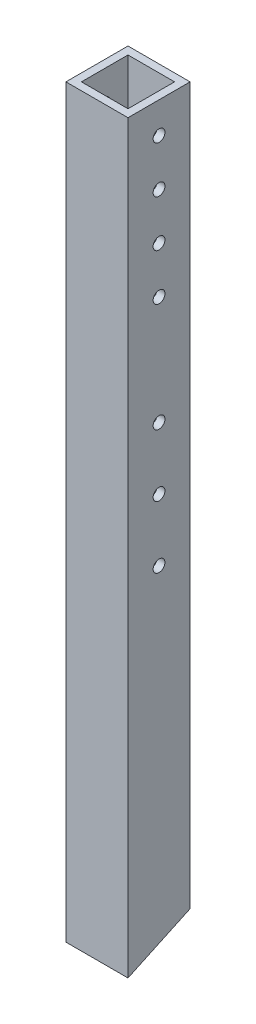
ISO-10303-21;
HEADER;
FILE_DESCRIPTION(('STEP AP214'),'2;1');
FILE_NAME('part.step','',(''),(''),'','','');
FILE_SCHEMA(('AUTOMOTIVE_DESIGN { 1 0 10303 214 1 1 1 1 }'));
ENDSEC;
DATA;
#1=APPLICATION_CONTEXT('core data for automotive mechanical design processes');
#2=APPLICATION_PROTOCOL_DEFINITION('international standard','automotive_design',2000,#1);
#3=PRODUCT_CONTEXT('',#1,'mechanical');
#4=PRODUCT('Part','Part','',(#3));
#5=PRODUCT_RELATED_PRODUCT_CATEGORY('part','',(#4));
#6=PRODUCT_DEFINITION_FORMATION('','',#4);
#7=PRODUCT_DEFINITION_CONTEXT('part definition',#1,'design');
#8=PRODUCT_DEFINITION('design','',#6,#7);
#9=PRODUCT_DEFINITION_SHAPE('','',#8);
#10=(LENGTH_UNIT() NAMED_UNIT(*) SI_UNIT(.MILLI.,.METRE.));
#11=(NAMED_UNIT(*) PLANE_ANGLE_UNIT() SI_UNIT($,.RADIAN.));
#12=(NAMED_UNIT(*) SI_UNIT($,.STERADIAN.) SOLID_ANGLE_UNIT());
#13=UNCERTAINTY_MEASURE_WITH_UNIT(LENGTH_MEASURE(1.E-05),#10,'distance_accuracy_value','');
#14=(GEOMETRIC_REPRESENTATION_CONTEXT(3) GLOBAL_UNCERTAINTY_ASSIGNED_CONTEXT((#13)) GLOBAL_UNIT_ASSIGNED_CONTEXT((#10,
#11,#12)) REPRESENTATION_CONTEXT('',''));
#15=CARTESIAN_POINT('',(0.,0.,0.));
#16=DIRECTION('',(0.,0.,1.));
#17=DIRECTION('',(1.,0.,0.));
#18=AXIS2_PLACEMENT_3D('',#15,#16,#17);
#19=CARTESIAN_POINT('',(12.7,304.8,-12.7));
#20=DIRECTION('',(0.,-1.,0.));
#21=DIRECTION('',(0.,0.,-1.));
#22=AXIS2_PLACEMENT_3D('',#19,#20,#21);
#23=PLANE('',#22);
#24=DIRECTION('',(0.,0.,-1.));
#25=VECTOR('',#24,1.);
#26=CARTESIAN_POINT('',(12.7,304.8,12.7));
#27=LINE('',#26,#25);
#28=CARTESIAN_POINT('',(12.7,304.8,12.7));
#29=VERTEX_POINT('',#28);
#30=CARTESIAN_POINT('',(12.7,304.8,-12.7));
#31=VERTEX_POINT('',#30);
#32=EDGE_CURVE('E228',#29,#31,#27,.T.);
#33=ORIENTED_EDGE('',*,*,#32,.T.);
#34=DIRECTION('',(-1.,0.,0.));
#35=VECTOR('',#34,1.);
#36=CARTESIAN_POINT('',(-12.7,304.8,-12.7));
#37=LINE('',#36,#35);
#38=CARTESIAN_POINT('',(-12.7,304.8,-12.7));
#39=VERTEX_POINT('',#38);
#40=EDGE_CURVE('E231',#31,#39,#37,.T.);
#41=ORIENTED_EDGE('',*,*,#40,.T.);
#42=DIRECTION('',(0.,0.,1.));
#43=VECTOR('',#42,1.);
#44=CARTESIAN_POINT('',(-12.7,304.8,12.7));
#45=LINE('',#44,#43);
#46=CARTESIAN_POINT('',(-12.7,304.8,12.7));
#47=VERTEX_POINT('',#46);
#48=EDGE_CURVE('E118',#39,#47,#45,.T.);
#49=ORIENTED_EDGE('',*,*,#48,.T.);
#50=DIRECTION('',(1.,0.,0.));
#51=VECTOR('',#50,1.);
#52=CARTESIAN_POINT('',(-12.7,304.8,12.7));
#53=LINE('',#52,#51);
#54=EDGE_CURVE('E234',#47,#29,#53,.T.);
#55=ORIENTED_EDGE('',*,*,#54,.T.);
#56=EDGE_LOOP('',(#33,#41,#49,#55));
#57=FACE_BOUND('',#56,.T.);
#58=DIRECTION('',(1.,0.,0.));
#59=VECTOR('',#58,1.);
#60=CARTESIAN_POINT('',(-9.525,304.8,9.525));
#61=LINE('',#60,#59);
#62=CARTESIAN_POINT('',(-9.525,304.8,9.525));
#63=VERTEX_POINT('',#62);
#64=CARTESIAN_POINT('',(9.525,304.8,9.525));
#65=VERTEX_POINT('',#64);
#66=EDGE_CURVE('E210',#63,#65,#61,.T.);
#67=ORIENTED_EDGE('',*,*,#66,.F.);
#68=DIRECTION('',(0.,0.,1.));
#69=VECTOR('',#68,1.);
#70=CARTESIAN_POINT('',(-9.525,304.8,9.525));
#71=LINE('',#70,#69);
#72=CARTESIAN_POINT('',(-9.525,304.8,-9.525));
#73=VERTEX_POINT('',#72);
#74=EDGE_CURVE('E216',#73,#63,#71,.T.);
#75=ORIENTED_EDGE('',*,*,#74,.F.);
#76=DIRECTION('',(-1.,0.,0.));
#77=VECTOR('',#76,1.);
#78=CARTESIAN_POINT('',(-9.525,304.8,-9.525));
#79=LINE('',#78,#77);
#80=CARTESIAN_POINT('',(9.525,304.8,-9.525));
#81=VERTEX_POINT('',#80);
#82=EDGE_CURVE('E214',#81,#73,#79,.T.);
#83=ORIENTED_EDGE('',*,*,#82,.F.);
#84=DIRECTION('',(0.,0.,-1.));
#85=VECTOR('',#84,1.);
#86=CARTESIAN_POINT('',(9.525,304.8,9.525));
#87=LINE('',#86,#85);
#88=EDGE_CURVE('E212',#65,#81,#87,.T.);
#89=ORIENTED_EDGE('',*,*,#88,.F.);
#90=EDGE_LOOP('',(#67,#75,#83,#89));
#91=FACE_BOUND('',#90,.T.);
#92=ADVANCED_FACE('F31',(#57,#91),#23,.F.);
#93=CARTESIAN_POINT('',(12.7,304.8,12.7));
#94=DIRECTION('',(-1.,0.,0.));
#95=DIRECTION('',(0.,0.,1.));
#96=AXIS2_PLACEMENT_3D('',#93,#94,#95);
#97=PLANE('',#96);
#98=CARTESIAN_POINT('',(12.7,139.7,0.));
#99=DIRECTION('',(1.,0.,0.));
#100=DIRECTION('',(0.,0.,-1.));
#101=AXIS2_PLACEMENT_3D('',#98,#99,#100);
#102=CIRCLE('',#101,2.41300000000002);
#103=CARTESIAN_POINT('',(12.7,139.7,-2.41300000000002));
#104=VERTEX_POINT('',#103);
#105=EDGE_CURVE('E293',#104,#104,#102,.T.);
#106=ORIENTED_EDGE('',*,*,#105,.F.);
#107=EDGE_LOOP('',(#106));
#108=FACE_BOUND('',#107,.T.);
#109=CARTESIAN_POINT('',(12.7,165.1,0.));
#110=DIRECTION('',(1.,0.,0.));
#111=DIRECTION('',(0.,0.,-1.));
#112=AXIS2_PLACEMENT_3D('',#109,#110,#111);
#113=CIRCLE('',#112,2.41300000000002);
#114=CARTESIAN_POINT('',(12.7,165.1,-2.41299999999999));
#115=VERTEX_POINT('',#114);
#116=EDGE_CURVE('E160',#115,#115,#113,.T.);
#117=ORIENTED_EDGE('',*,*,#116,.F.);
#118=EDGE_LOOP('',(#117));
#119=FACE_BOUND('',#118,.T.);
#120=CARTESIAN_POINT('',(12.7,190.5,0.));
#121=DIRECTION('',(1.,0.,0.));
#122=DIRECTION('',(0.,0.,-1.));
#123=AXIS2_PLACEMENT_3D('',#120,#121,#122);
#124=CIRCLE('',#123,2.41300000000001);
#125=CARTESIAN_POINT('',(12.7,190.5,-2.41300000000002));
#126=VERTEX_POINT('',#125);
#127=EDGE_CURVE('E157',#126,#126,#124,.T.);
#128=ORIENTED_EDGE('',*,*,#127,.F.);
#129=EDGE_LOOP('',(#128));
#130=FACE_BOUND('',#129,.T.);
#131=CARTESIAN_POINT('',(12.7,234.95,0.));
#132=DIRECTION('',(1.,0.,0.));
#133=DIRECTION('',(0.,0.,-1.));
#134=AXIS2_PLACEMENT_3D('',#131,#132,#133);
#135=CIRCLE('',#134,2.41300000000001);
#136=CARTESIAN_POINT('',(12.7,234.95,-2.41300000000001));
#137=VERTEX_POINT('',#136);
#138=EDGE_CURVE('E176',#137,#137,#135,.T.);
#139=ORIENTED_EDGE('',*,*,#138,.F.);
#140=EDGE_LOOP('',(#139));
#141=FACE_BOUND('',#140,.T.);
#142=CARTESIAN_POINT('',(12.7,254.,0.));
#143=DIRECTION('',(1.,0.,0.));
#144=DIRECTION('',(0.,0.,-1.));
#145=AXIS2_PLACEMENT_3D('',#142,#143,#144);
#146=CIRCLE('',#145,2.41300000000001);
#147=CARTESIAN_POINT('',(12.7,254.,-2.41300000000001));
#148=VERTEX_POINT('',#147);
#149=EDGE_CURVE('E183',#148,#148,#146,.T.);
#150=ORIENTED_EDGE('',*,*,#149,.F.);
#151=EDGE_LOOP('',(#150));
#152=FACE_BOUND('',#151,.T.);
#153=CARTESIAN_POINT('',(12.7,273.05,0.));
#154=DIRECTION('',(1.,0.,0.));
#155=DIRECTION('',(0.,0.,-1.));
#156=AXIS2_PLACEMENT_3D('',#153,#154,#155);
#157=CIRCLE('',#156,2.41300000000001);
#158=CARTESIAN_POINT('',(12.7,273.05,-2.41300000000001));
#159=VERTEX_POINT('',#158);
#160=EDGE_CURVE('E190',#159,#159,#157,.T.);
#161=ORIENTED_EDGE('',*,*,#160,.F.);
#162=EDGE_LOOP('',(#161));
#163=FACE_BOUND('',#162,.T.);
#164=CARTESIAN_POINT('',(12.7,292.1,0.));
#165=DIRECTION('',(1.,0.,0.));
#166=DIRECTION('',(0.,0.,-1.));
#167=AXIS2_PLACEMENT_3D('',#164,#165,#166);
#168=CIRCLE('',#167,2.41300000000001);
#169=CARTESIAN_POINT('',(12.7,292.1,-2.41300000000001));
#170=VERTEX_POINT('',#169);
#171=EDGE_CURVE('E203',#170,#170,#168,.T.);
#172=ORIENTED_EDGE('',*,*,#171,.F.);
#173=EDGE_LOOP('',(#172));
#174=FACE_BOUND('',#173,.T.);
#175=DIRECTION('',(0.,-1.,0.));
#176=VECTOR('',#175,1.);
#177=CARTESIAN_POINT('',(12.7,304.8,12.7));
#178=LINE('',#177,#176);
#179=CARTESIAN_POINT('',(12.7,0.,12.7));
#180=VERTEX_POINT('',#179);
#181=EDGE_CURVE('E122',#29,#180,#178,.T.);
#182=ORIENTED_EDGE('',*,*,#181,.T.);
#183=DIRECTION('',(0.,-0.422618261740695,0.906307787036652));
#184=VECTOR('',#183,1.);
#185=CARTESIAN_POINT('',(12.7,0.,12.7));
#186=LINE('',#185,#184);
#187=CARTESIAN_POINT('',(12.7,11.8442145171368,-12.7));
#188=VERTEX_POINT('',#187);
#189=EDGE_CURVE('E107',#188,#180,#186,.T.);
#190=ORIENTED_EDGE('',*,*,#189,.F.);
#191=DIRECTION('',(0.,-1.,0.));
#192=VECTOR('',#191,1.);
#193=CARTESIAN_POINT('',(12.7,304.8,-12.7));
#194=LINE('',#193,#192);
#195=EDGE_CURVE('E40',#31,#188,#194,.T.);
#196=ORIENTED_EDGE('',*,*,#195,.F.);
#197=ORIENTED_EDGE('',*,*,#32,.F.);
#198=EDGE_LOOP('',(#182,#190,#196,#197));
#199=FACE_BOUND('',#198,.T.);
#200=ADVANCED_FACE('F33',(#108,#119,#130,#141,#152,#163,#174,#199),#97,.F.);
#201=CARTESIAN_POINT('',(-12.7,304.8,-12.7));
#202=DIRECTION('',(0.,0.,1.));
#203=DIRECTION('',(1.,0.,0.));
#204=AXIS2_PLACEMENT_3D('',#201,#202,#203);
#205=PLANE('',#204);
#206=ORIENTED_EDGE('',*,*,#195,.T.);
#207=DIRECTION('',(1.,0.,0.));
#208=VECTOR('',#207,1.);
#209=CARTESIAN_POINT('',(-12.7,11.8442145171368,-12.7));
#210=LINE('',#209,#208);
#211=CARTESIAN_POINT('',(-12.7,11.8442145171368,-12.7));
#212=VERTEX_POINT('',#211);
#213=EDGE_CURVE('E99',#212,#188,#210,.T.);
#214=ORIENTED_EDGE('',*,*,#213,.F.);
#215=DIRECTION('',(0.,-1.,0.));
#216=VECTOR('',#215,1.);
#217=CARTESIAN_POINT('',(-12.7,304.8,-12.7));
#218=LINE('',#217,#216);
#219=EDGE_CURVE('E113',#39,#212,#218,.T.);
#220=ORIENTED_EDGE('',*,*,#219,.F.);
#221=ORIENTED_EDGE('',*,*,#40,.F.);
#222=EDGE_LOOP('',(#206,#214,#220,#221));
#223=FACE_BOUND('',#222,.T.);
#224=ADVANCED_FACE('F112',(#223),#205,.F.);
#225=CARTESIAN_POINT('',(-12.7,304.8,12.7));
#226=DIRECTION('',(1.,0.,0.));
#227=DIRECTION('',(0.,0.,-1.));
#228=AXIS2_PLACEMENT_3D('',#225,#226,#227);
#229=PLANE('',#228);
#230=CARTESIAN_POINT('',(-12.7,139.7,0.));
#231=DIRECTION('',(1.,0.,0.));
#232=DIRECTION('',(0.,0.,-1.));
#233=AXIS2_PLACEMENT_3D('',#230,#231,#232);
#234=CIRCLE('',#233,2.41300000000002);
#235=CARTESIAN_POINT('',(-12.7,139.7,-2.41300000000002));
#236=VERTEX_POINT('',#235);
#237=EDGE_CURVE('E355',#236,#236,#234,.T.);
#238=ORIENTED_EDGE('',*,*,#237,.T.);
#239=EDGE_LOOP('',(#238));
#240=FACE_BOUND('',#239,.T.);
#241=CARTESIAN_POINT('',(-12.7,165.1,0.));
#242=DIRECTION('',(1.,0.,0.));
#243=DIRECTION('',(0.,0.,-1.));
#244=AXIS2_PLACEMENT_3D('',#241,#242,#243);
#245=CIRCLE('',#244,2.41300000000002);
#246=CARTESIAN_POINT('',(-12.7,165.1,-2.41299999999999));
#247=VERTEX_POINT('',#246);
#248=EDGE_CURVE('E153',#247,#247,#245,.T.);
#249=ORIENTED_EDGE('',*,*,#248,.T.);
#250=EDGE_LOOP('',(#249));
#251=FACE_BOUND('',#250,.T.);
#252=CARTESIAN_POINT('',(-12.7,190.5,0.));
#253=DIRECTION('',(1.,0.,0.));
#254=DIRECTION('',(0.,0.,-1.));
#255=AXIS2_PLACEMENT_3D('',#252,#253,#254);
#256=CIRCLE('',#255,2.41300000000001);
#257=CARTESIAN_POINT('',(-12.7,190.5,-2.41300000000002));
#258=VERTEX_POINT('',#257);
#259=EDGE_CURVE('E149',#258,#258,#256,.T.);
#260=ORIENTED_EDGE('',*,*,#259,.T.);
#261=EDGE_LOOP('',(#260));
#262=FACE_BOUND('',#261,.T.);
#263=CARTESIAN_POINT('',(-12.7,234.95,0.));
#264=DIRECTION('',(1.,0.,0.));
#265=DIRECTION('',(0.,0.,-1.));
#266=AXIS2_PLACEMENT_3D('',#263,#264,#265);
#267=CIRCLE('',#266,2.41300000000001);
#268=CARTESIAN_POINT('',(-12.7,234.95,-2.41300000000001));
#269=VERTEX_POINT('',#268);
#270=EDGE_CURVE('E145',#269,#269,#267,.T.);
#271=ORIENTED_EDGE('',*,*,#270,.T.);
#272=EDGE_LOOP('',(#271));
#273=FACE_BOUND('',#272,.T.);
#274=CARTESIAN_POINT('',(-12.7,254.,0.));
#275=DIRECTION('',(1.,0.,0.));
#276=DIRECTION('',(0.,0.,-1.));
#277=AXIS2_PLACEMENT_3D('',#274,#275,#276);
#278=CIRCLE('',#277,2.41300000000001);
#279=CARTESIAN_POINT('',(-12.7,254.,-2.41300000000001));
#280=VERTEX_POINT('',#279);
#281=EDGE_CURVE('E140',#280,#280,#278,.T.);
#282=ORIENTED_EDGE('',*,*,#281,.T.);
#283=EDGE_LOOP('',(#282));
#284=FACE_BOUND('',#283,.T.);
#285=CARTESIAN_POINT('',(-12.7,273.05,0.));
#286=DIRECTION('',(1.,0.,0.));
#287=DIRECTION('',(0.,0.,-1.));
#288=AXIS2_PLACEMENT_3D('',#285,#286,#287);
#289=CIRCLE('',#288,2.41300000000001);
#290=CARTESIAN_POINT('',(-12.7,273.05,-2.41300000000001));
#291=VERTEX_POINT('',#290);
#292=EDGE_CURVE('E135',#291,#291,#289,.T.);
#293=ORIENTED_EDGE('',*,*,#292,.T.);
#294=EDGE_LOOP('',(#293));
#295=FACE_BOUND('',#294,.T.);
#296=CARTESIAN_POINT('',(-12.7,292.1,0.));
#297=DIRECTION('',(1.,0.,0.));
#298=DIRECTION('',(0.,0.,-1.));
#299=AXIS2_PLACEMENT_3D('',#296,#297,#298);
#300=CIRCLE('',#299,2.41300000000001);
#301=CARTESIAN_POINT('',(-12.7,292.1,-2.41300000000001));
#302=VERTEX_POINT('',#301);
#303=EDGE_CURVE('E129',#302,#302,#300,.T.);
#304=ORIENTED_EDGE('',*,*,#303,.T.);
#305=EDGE_LOOP('',(#304));
#306=FACE_BOUND('',#305,.T.);
#307=ORIENTED_EDGE('',*,*,#219,.T.);
#308=DIRECTION('',(0.,-0.422618261740695,0.906307787036652));
#309=VECTOR('',#308,1.);
#310=CARTESIAN_POINT('',(-12.7,0.,12.7));
#311=LINE('',#310,#309);
#312=CARTESIAN_POINT('',(-12.7,0.,12.7));
#313=VERTEX_POINT('',#312);
#314=EDGE_CURVE('E96',#212,#313,#311,.T.);
#315=ORIENTED_EDGE('',*,*,#314,.T.);
#316=DIRECTION('',(0.,-1.,0.));
#317=VECTOR('',#316,1.);
#318=CARTESIAN_POINT('',(-12.7,304.8,12.7));
#319=LINE('',#318,#317);
#320=EDGE_CURVE('E119',#47,#313,#319,.T.);
#321=ORIENTED_EDGE('',*,*,#320,.F.);
#322=ORIENTED_EDGE('',*,*,#48,.F.);
#323=EDGE_LOOP('',(#307,#315,#321,#322));
#324=FACE_BOUND('',#323,.T.);
#325=ADVANCED_FACE('F117',(#240,#251,#262,#273,#284,#295,#306,#324),#229,.F.);
#326=CARTESIAN_POINT('',(-12.7,304.8,12.7));
#327=DIRECTION('',(0.,0.,-1.));
#328=DIRECTION('',(-1.,0.,0.));
#329=AXIS2_PLACEMENT_3D('',#326,#327,#328);
#330=PLANE('',#329);
#331=DIRECTION('',(1.,0.,0.));
#332=VECTOR('',#331,1.);
#333=CARTESIAN_POINT('',(-12.7,0.,12.7));
#334=LINE('',#333,#332);
#335=EDGE_CURVE('E102',#313,#180,#334,.T.);
#336=ORIENTED_EDGE('',*,*,#335,.T.);
#337=ORIENTED_EDGE('',*,*,#181,.F.);
#338=ORIENTED_EDGE('',*,*,#54,.F.);
#339=ORIENTED_EDGE('',*,*,#320,.T.);
#340=EDGE_LOOP('',(#336,#337,#338,#339));
#341=FACE_BOUND('',#340,.T.);
#342=ADVANCED_FACE('F242',(#341),#330,.F.);
#343=CARTESIAN_POINT('',(-9.525,304.8,9.525));
#344=DIRECTION('',(0.,0.,-1.));
#345=DIRECTION('',(-1.,0.,0.));
#346=AXIS2_PLACEMENT_3D('',#343,#344,#345);
#347=PLANE('',#346);
#348=DIRECTION('',(1.,0.,0.));
#349=VECTOR('',#348,1.);
#350=CARTESIAN_POINT('',(-9.525,1.48052681464211,9.525));
#351=LINE('',#350,#349);
#352=CARTESIAN_POINT('',(-9.525,1.48052681464209,9.52500000000001));
#353=VERTEX_POINT('',#352);
#354=CARTESIAN_POINT('',(9.525,1.48052681464209,9.52500000000001));
#355=VERTEX_POINT('',#354);
#356=EDGE_CURVE('E201',#353,#355,#351,.T.);
#357=ORIENTED_EDGE('',*,*,#356,.F.);
#358=DIRECTION('',(0.,-1.,0.));
#359=VECTOR('',#358,1.);
#360=CARTESIAN_POINT('',(-9.525,304.8,9.525));
#361=LINE('',#360,#359);
#362=EDGE_CURVE('E218',#63,#353,#361,.T.);
#363=ORIENTED_EDGE('',*,*,#362,.F.);
#364=ORIENTED_EDGE('',*,*,#66,.T.);
#365=DIRECTION('',(0.,-1.,0.));
#366=VECTOR('',#365,1.);
#367=CARTESIAN_POINT('',(9.525,304.8,9.525));
#368=LINE('',#367,#366);
#369=EDGE_CURVE('E225',#65,#355,#368,.T.);
#370=ORIENTED_EDGE('',*,*,#369,.T.);
#371=EDGE_LOOP('',(#357,#363,#364,#370));
#372=FACE_BOUND('',#371,.T.);
#373=ADVANCED_FACE('F255',(#372),#347,.T.);
#374=CARTESIAN_POINT('',(9.525,304.8,9.525));
#375=DIRECTION('',(-1.,0.,0.));
#376=DIRECTION('',(0.,0.,1.));
#377=AXIS2_PLACEMENT_3D('',#374,#375,#376);
#378=PLANE('',#377);
#379=CARTESIAN_POINT('',(9.525,139.7,0.));
#380=DIRECTION('',(-1.,0.,0.));
#381=DIRECTION('',(0.,0.,1.));
#382=AXIS2_PLACEMENT_3D('',#379,#380,#381);
#383=CIRCLE('',#382,2.41300000000002);
#384=CARTESIAN_POINT('',(9.525,139.7,2.41300000000002));
#385=VERTEX_POINT('',#384);
#386=EDGE_CURVE('E165',#385,#385,#383,.T.);
#387=ORIENTED_EDGE('',*,*,#386,.F.);
#388=EDGE_LOOP('',(#387));
#389=FACE_BOUND('',#388,.T.);
#390=CARTESIAN_POINT('',(9.525,165.1,0.));
#391=DIRECTION('',(-1.,0.,0.));
#392=DIRECTION('',(0.,0.,1.));
#393=AXIS2_PLACEMENT_3D('',#390,#391,#392);
#394=CIRCLE('',#393,2.41300000000002);
#395=CARTESIAN_POINT('',(9.525,165.1,2.41300000000004));
#396=VERTEX_POINT('',#395);
#397=EDGE_CURVE('E152',#396,#396,#394,.T.);
#398=ORIENTED_EDGE('',*,*,#397,.F.);
#399=EDGE_LOOP('',(#398));
#400=FACE_BOUND('',#399,.T.);
#401=CARTESIAN_POINT('',(9.525,190.5,0.));
#402=DIRECTION('',(-1.,0.,0.));
#403=DIRECTION('',(0.,0.,1.));
#404=AXIS2_PLACEMENT_3D('',#401,#402,#403);
#405=CIRCLE('',#404,2.41300000000001);
#406=CARTESIAN_POINT('',(9.525,190.5,2.413));
#407=VERTEX_POINT('',#406);
#408=EDGE_CURVE('E148',#407,#407,#405,.T.);
#409=ORIENTED_EDGE('',*,*,#408,.F.);
#410=EDGE_LOOP('',(#409));
#411=FACE_BOUND('',#410,.T.);
#412=CARTESIAN_POINT('',(9.525,234.95,0.));
#413=DIRECTION('',(-1.,0.,0.));
#414=DIRECTION('',(0.,0.,1.));
#415=AXIS2_PLACEMENT_3D('',#412,#413,#414);
#416=CIRCLE('',#415,2.41300000000001);
#417=CARTESIAN_POINT('',(9.525,234.95,2.41300000000002));
#418=VERTEX_POINT('',#417);
#419=EDGE_CURVE('E144',#418,#418,#416,.T.);
#420=ORIENTED_EDGE('',*,*,#419,.F.);
#421=EDGE_LOOP('',(#420));
#422=FACE_BOUND('',#421,.T.);
#423=CARTESIAN_POINT('',(9.525,254.,0.));
#424=DIRECTION('',(-1.,0.,0.));
#425=DIRECTION('',(0.,0.,1.));
#426=AXIS2_PLACEMENT_3D('',#423,#424,#425);
#427=CIRCLE('',#426,2.41300000000001);
#428=CARTESIAN_POINT('',(9.525,254.,2.41300000000002));
#429=VERTEX_POINT('',#428);
#430=EDGE_CURVE('E139',#429,#429,#427,.T.);
#431=ORIENTED_EDGE('',*,*,#430,.F.);
#432=EDGE_LOOP('',(#431));
#433=FACE_BOUND('',#432,.T.);
#434=CARTESIAN_POINT('',(9.525,273.05,0.));
#435=DIRECTION('',(-1.,0.,0.));
#436=DIRECTION('',(0.,0.,1.));
#437=AXIS2_PLACEMENT_3D('',#434,#435,#436);
#438=CIRCLE('',#437,2.41300000000001);
#439=CARTESIAN_POINT('',(9.525,273.05,2.41300000000001));
#440=VERTEX_POINT('',#439);
#441=EDGE_CURVE('E134',#440,#440,#438,.T.);
#442=ORIENTED_EDGE('',*,*,#441,.F.);
#443=EDGE_LOOP('',(#442));
#444=FACE_BOUND('',#443,.T.);
#445=DIRECTION('',(0.,0.422618261740695,-0.906307787036652));
#446=VECTOR('',#445,1.);
#447=CARTESIAN_POINT('',(9.525,55.6552638372215,-106.653098461709));
#448=LINE('',#447,#446);
#449=CARTESIAN_POINT('',(9.525,10.3636877024947,-9.525));
#450=VERTEX_POINT('',#449);
#451=EDGE_CURVE('E199',#355,#450,#448,.T.);
#452=ORIENTED_EDGE('',*,*,#451,.F.);
#453=ORIENTED_EDGE('',*,*,#369,.F.);
#454=ORIENTED_EDGE('',*,*,#88,.T.);
#455=DIRECTION('',(0.,-1.,0.));
#456=VECTOR('',#455,1.);
#457=CARTESIAN_POINT('',(9.525,304.8,-9.525));
#458=LINE('',#457,#456);
#459=EDGE_CURVE('E222',#81,#450,#458,.T.);
#460=ORIENTED_EDGE('',*,*,#459,.T.);
#461=EDGE_LOOP('',(#452,#453,#454,#460));
#462=FACE_BOUND('',#461,.T.);
#463=CARTESIAN_POINT('',(9.525,292.1,0.));
#464=DIRECTION('',(-1.,0.,0.));
#465=DIRECTION('',(0.,0.,1.));
#466=AXIS2_PLACEMENT_3D('',#463,#464,#465);
#467=CIRCLE('',#466,2.41300000000001);
#468=CARTESIAN_POINT('',(9.525,292.1,2.41300000000001));
#469=VERTEX_POINT('',#468);
#470=EDGE_CURVE('E128',#469,#469,#467,.T.);
#471=ORIENTED_EDGE('',*,*,#470,.F.);
#472=EDGE_LOOP('',(#471));
#473=FACE_BOUND('',#472,.T.);
#474=ADVANCED_FACE('F258',(#389,#400,#411,#422,#433,#444,#462,#473),#378,.T.);
#475=CARTESIAN_POINT('',(-9.525,304.8,-9.525));
#476=DIRECTION('',(0.,0.,1.));
#477=DIRECTION('',(1.,0.,0.));
#478=AXIS2_PLACEMENT_3D('',#475,#476,#477);
#479=PLANE('',#478);
#480=DIRECTION('',(-1.,0.,0.));
#481=VECTOR('',#480,1.);
#482=CARTESIAN_POINT('',(-9.525,10.3636877024947,-9.525));
#483=LINE('',#482,#481);
#484=CARTESIAN_POINT('',(-9.525,10.3636877024948,-9.52500000000002));
#485=VERTEX_POINT('',#484);
#486=EDGE_CURVE('E47',#450,#485,#483,.T.);
#487=ORIENTED_EDGE('',*,*,#486,.F.);
#488=ORIENTED_EDGE('',*,*,#459,.F.);
#489=ORIENTED_EDGE('',*,*,#82,.T.);
#490=DIRECTION('',(0.,-1.,0.));
#491=VECTOR('',#490,1.);
#492=CARTESIAN_POINT('',(-9.525,304.8,-9.525));
#493=LINE('',#492,#491);
#494=EDGE_CURVE('E54',#73,#485,#493,.T.);
#495=ORIENTED_EDGE('',*,*,#494,.T.);
#496=EDGE_LOOP('',(#487,#488,#489,#495));
#497=FACE_BOUND('',#496,.T.);
#498=ADVANCED_FACE('F262',(#497),#479,.T.);
#499=CARTESIAN_POINT('',(-9.525,304.8,9.525));
#500=DIRECTION('',(1.,0.,0.));
#501=DIRECTION('',(0.,0.,-1.));
#502=AXIS2_PLACEMENT_3D('',#499,#500,#501);
#503=PLANE('',#502);
#504=CARTESIAN_POINT('',(-9.525,139.7,0.));
#505=DIRECTION('',(1.,0.,0.));
#506=DIRECTION('',(0.,0.,-1.));
#507=AXIS2_PLACEMENT_3D('',#504,#505,#506);
#508=CIRCLE('',#507,2.41300000000002);
#509=CARTESIAN_POINT('',(-9.525,139.7,-2.41300000000002));
#510=VERTEX_POINT('',#509);
#511=EDGE_CURVE('E35',#510,#510,#508,.T.);
#512=ORIENTED_EDGE('',*,*,#511,.F.);
#513=EDGE_LOOP('',(#512));
#514=FACE_BOUND('',#513,.T.);
#515=CARTESIAN_POINT('',(-9.525,165.1,0.));
#516=DIRECTION('',(1.,0.,0.));
#517=DIRECTION('',(0.,0.,-1.));
#518=AXIS2_PLACEMENT_3D('',#515,#516,#517);
#519=CIRCLE('',#518,2.41300000000002);
#520=CARTESIAN_POINT('',(-9.525,165.1,-2.41299999999999));
#521=VERTEX_POINT('',#520);
#522=EDGE_CURVE('E150',#521,#521,#519,.T.);
#523=ORIENTED_EDGE('',*,*,#522,.F.);
#524=EDGE_LOOP('',(#523));
#525=FACE_BOUND('',#524,.T.);
#526=CARTESIAN_POINT('',(-9.525,190.5,0.));
#527=DIRECTION('',(1.,0.,0.));
#528=DIRECTION('',(0.,0.,-1.));
#529=AXIS2_PLACEMENT_3D('',#526,#527,#528);
#530=CIRCLE('',#529,2.41300000000001);
#531=CARTESIAN_POINT('',(-9.525,190.5,-2.41300000000002));
#532=VERTEX_POINT('',#531);
#533=EDGE_CURVE('E146',#532,#532,#530,.T.);
#534=ORIENTED_EDGE('',*,*,#533,.F.);
#535=EDGE_LOOP('',(#534));
#536=FACE_BOUND('',#535,.T.);
#537=CARTESIAN_POINT('',(-9.525,234.95,0.));
#538=DIRECTION('',(1.,0.,0.));
#539=DIRECTION('',(0.,0.,-1.));
#540=AXIS2_PLACEMENT_3D('',#537,#538,#539);
#541=CIRCLE('',#540,2.41300000000001);
#542=CARTESIAN_POINT('',(-9.525,234.95,-2.41300000000001));
#543=VERTEX_POINT('',#542);
#544=EDGE_CURVE('E141',#543,#543,#541,.T.);
#545=ORIENTED_EDGE('',*,*,#544,.F.);
#546=EDGE_LOOP('',(#545));
#547=FACE_BOUND('',#546,.T.);
#548=CARTESIAN_POINT('',(-9.525,254.,0.));
#549=DIRECTION('',(1.,0.,0.));
#550=DIRECTION('',(0.,0.,-1.));
#551=AXIS2_PLACEMENT_3D('',#548,#549,#550);
#552=CIRCLE('',#551,2.41300000000001);
#553=CARTESIAN_POINT('',(-9.525,254.,-2.41300000000001));
#554=VERTEX_POINT('',#553);
#555=EDGE_CURVE('E136',#554,#554,#552,.T.);
#556=ORIENTED_EDGE('',*,*,#555,.F.);
#557=EDGE_LOOP('',(#556));
#558=FACE_BOUND('',#557,.T.);
#559=CARTESIAN_POINT('',(-9.525,273.05,0.));
#560=DIRECTION('',(1.,0.,0.));
#561=DIRECTION('',(0.,0.,-1.));
#562=AXIS2_PLACEMENT_3D('',#559,#560,#561);
#563=CIRCLE('',#562,2.41300000000001);
#564=CARTESIAN_POINT('',(-9.525,273.05,-2.41300000000001));
#565=VERTEX_POINT('',#564);
#566=EDGE_CURVE('E131',#565,#565,#563,.T.);
#567=ORIENTED_EDGE('',*,*,#566,.F.);
#568=EDGE_LOOP('',(#567));
#569=FACE_BOUND('',#568,.T.);
#570=DIRECTION('',(0.,-0.422618261740695,0.906307787036652));
#571=VECTOR('',#570,1.);
#572=CARTESIAN_POINT('',(-9.525,55.6552638372215,-106.653098461709));
#573=LINE('',#572,#571);
#574=EDGE_CURVE('E11',#485,#353,#573,.T.);
#575=ORIENTED_EDGE('',*,*,#574,.F.);
#576=ORIENTED_EDGE('',*,*,#494,.F.);
#577=ORIENTED_EDGE('',*,*,#74,.T.);
#578=ORIENTED_EDGE('',*,*,#362,.T.);
#579=EDGE_LOOP('',(#575,#576,#577,#578));
#580=FACE_BOUND('',#579,.T.);
#581=CARTESIAN_POINT('',(-9.525,292.1,0.));
#582=DIRECTION('',(1.,0.,0.));
#583=DIRECTION('',(0.,0.,-1.));
#584=AXIS2_PLACEMENT_3D('',#581,#582,#583);
#585=CIRCLE('',#584,2.41300000000001);
#586=CARTESIAN_POINT('',(-9.525,292.1,-2.41300000000001));
#587=VERTEX_POINT('',#586);
#588=EDGE_CURVE('E126',#587,#587,#585,.T.);
#589=ORIENTED_EDGE('',*,*,#588,.F.);
#590=EDGE_LOOP('',(#589));
#591=FACE_BOUND('',#590,.T.);
#592=ADVANCED_FACE('F264',(#514,#525,#536,#547,#558,#569,#580,#591),#503,.T.);
#593=CARTESIAN_POINT('',(-12.7,292.1,0.));
#594=DIRECTION('',(1.,0.,0.));
#595=DIRECTION('',(0.,0.,-1.));
#596=AXIS2_PLACEMENT_3D('',#593,#594,#595);
#597=CYLINDRICAL_SURFACE('',#596,2.41300000000001);
#598=ORIENTED_EDGE('',*,*,#588,.T.);
#599=EDGE_LOOP('',(#598));
#600=FACE_BOUND('',#599,.T.);
#601=ORIENTED_EDGE('',*,*,#303,.F.);
#602=EDGE_LOOP('',(#601));
#603=FACE_BOUND('',#602,.T.);
#604=ADVANCED_FACE('F270',(#600,#603),#597,.F.);
#605=ORIENTED_EDGE('',*,*,#470,.T.);
#606=EDGE_LOOP('',(#605));
#607=FACE_BOUND('',#606,.T.);
#608=ORIENTED_EDGE('',*,*,#171,.T.);
#609=EDGE_LOOP('',(#608));
#610=FACE_BOUND('',#609,.T.);
#611=ADVANCED_FACE('F306',(#607,#610),#597,.F.);
#612=CARTESIAN_POINT('',(-12.7,0.,12.7));
#613=DIRECTION('',(0.,0.906307787036652,0.422618261740695));
#614=DIRECTION('',(0.,-0.422618261740695,0.906307787036652));
#615=AXIS2_PLACEMENT_3D('',#612,#613,#614);
#616=PLANE('',#615);
#617=ORIENTED_EDGE('',*,*,#356,.T.);
#618=ORIENTED_EDGE('',*,*,#451,.T.);
#619=ORIENTED_EDGE('',*,*,#486,.T.);
#620=ORIENTED_EDGE('',*,*,#574,.T.);
#621=EDGE_LOOP('',(#617,#618,#619,#620));
#622=FACE_BOUND('',#621,.T.);
#623=ORIENTED_EDGE('',*,*,#189,.T.);
#624=ORIENTED_EDGE('',*,*,#335,.F.);
#625=ORIENTED_EDGE('',*,*,#314,.F.);
#626=ORIENTED_EDGE('',*,*,#213,.T.);
#627=EDGE_LOOP('',(#623,#624,#625,#626));
#628=FACE_BOUND('',#627,.T.);
#629=ADVANCED_FACE('F98',(#622,#628),#616,.F.);
#630=CARTESIAN_POINT('',(-12.7,273.05,0.));
#631=DIRECTION('',(1.,0.,0.));
#632=DIRECTION('',(0.,0.,-1.));
#633=AXIS2_PLACEMENT_3D('',#630,#631,#632);
#634=CYLINDRICAL_SURFACE('',#633,2.41300000000001);
#635=ORIENTED_EDGE('',*,*,#566,.T.);
#636=EDGE_LOOP('',(#635));
#637=FACE_BOUND('',#636,.T.);
#638=ORIENTED_EDGE('',*,*,#292,.F.);
#639=EDGE_LOOP('',(#638));
#640=FACE_BOUND('',#639,.T.);
#641=ADVANCED_FACE('F313',(#637,#640),#634,.F.);
#642=ORIENTED_EDGE('',*,*,#441,.T.);
#643=EDGE_LOOP('',(#642));
#644=FACE_BOUND('',#643,.T.);
#645=ORIENTED_EDGE('',*,*,#160,.T.);
#646=EDGE_LOOP('',(#645));
#647=FACE_BOUND('',#646,.T.);
#648=ADVANCED_FACE('F319',(#644,#647),#634,.F.);
#649=CARTESIAN_POINT('',(-12.7,254.,0.));
#650=DIRECTION('',(1.,0.,0.));
#651=DIRECTION('',(0.,0.,-1.));
#652=AXIS2_PLACEMENT_3D('',#649,#650,#651);
#653=CYLINDRICAL_SURFACE('',#652,2.41300000000001);
#654=ORIENTED_EDGE('',*,*,#555,.T.);
#655=EDGE_LOOP('',(#654));
#656=FACE_BOUND('',#655,.T.);
#657=ORIENTED_EDGE('',*,*,#281,.F.);
#658=EDGE_LOOP('',(#657));
#659=FACE_BOUND('',#658,.T.);
#660=ADVANCED_FACE('F321',(#656,#659),#653,.F.);
#661=ORIENTED_EDGE('',*,*,#430,.T.);
#662=EDGE_LOOP('',(#661));
#663=FACE_BOUND('',#662,.T.);
#664=ORIENTED_EDGE('',*,*,#149,.T.);
#665=EDGE_LOOP('',(#664));
#666=FACE_BOUND('',#665,.T.);
#667=ADVANCED_FACE('F324',(#663,#666),#653,.F.);
#668=CARTESIAN_POINT('',(-12.7,234.95,0.));
#669=DIRECTION('',(1.,0.,0.));
#670=DIRECTION('',(0.,0.,-1.));
#671=AXIS2_PLACEMENT_3D('',#668,#669,#670);
#672=CYLINDRICAL_SURFACE('',#671,2.41300000000001);
#673=ORIENTED_EDGE('',*,*,#544,.T.);
#674=EDGE_LOOP('',(#673));
#675=FACE_BOUND('',#674,.T.);
#676=ORIENTED_EDGE('',*,*,#270,.F.);
#677=EDGE_LOOP('',(#676));
#678=FACE_BOUND('',#677,.T.);
#679=ADVANCED_FACE('F326',(#675,#678),#672,.F.);
#680=ORIENTED_EDGE('',*,*,#419,.T.);
#681=EDGE_LOOP('',(#680));
#682=FACE_BOUND('',#681,.T.);
#683=ORIENTED_EDGE('',*,*,#138,.T.);
#684=EDGE_LOOP('',(#683));
#685=FACE_BOUND('',#684,.T.);
#686=ADVANCED_FACE('F329',(#682,#685),#672,.F.);
#687=CARTESIAN_POINT('',(-12.7,190.5,0.));
#688=DIRECTION('',(1.,0.,0.));
#689=DIRECTION('',(0.,0.,-1.));
#690=AXIS2_PLACEMENT_3D('',#687,#688,#689);
#691=CYLINDRICAL_SURFACE('',#690,2.41300000000001);
#692=ORIENTED_EDGE('',*,*,#533,.T.);
#693=EDGE_LOOP('',(#692));
#694=FACE_BOUND('',#693,.T.);
#695=ORIENTED_EDGE('',*,*,#259,.F.);
#696=EDGE_LOOP('',(#695));
#697=FACE_BOUND('',#696,.T.);
#698=ADVANCED_FACE('F331',(#694,#697),#691,.F.);
#699=ORIENTED_EDGE('',*,*,#408,.T.);
#700=EDGE_LOOP('',(#699));
#701=FACE_BOUND('',#700,.T.);
#702=ORIENTED_EDGE('',*,*,#127,.T.);
#703=EDGE_LOOP('',(#702));
#704=FACE_BOUND('',#703,.T.);
#705=ADVANCED_FACE('F334',(#701,#704),#691,.F.);
#706=CARTESIAN_POINT('',(-12.7,165.1,0.));
#707=DIRECTION('',(1.,0.,0.));
#708=DIRECTION('',(0.,0.,-1.));
#709=AXIS2_PLACEMENT_3D('',#706,#707,#708);
#710=CYLINDRICAL_SURFACE('',#709,2.41300000000002);
#711=ORIENTED_EDGE('',*,*,#522,.T.);
#712=EDGE_LOOP('',(#711));
#713=FACE_BOUND('',#712,.T.);
#714=ORIENTED_EDGE('',*,*,#248,.F.);
#715=EDGE_LOOP('',(#714));
#716=FACE_BOUND('',#715,.T.);
#717=ADVANCED_FACE('F336',(#713,#716),#710,.F.);
#718=ORIENTED_EDGE('',*,*,#397,.T.);
#719=EDGE_LOOP('',(#718));
#720=FACE_BOUND('',#719,.T.);
#721=ORIENTED_EDGE('',*,*,#116,.T.);
#722=EDGE_LOOP('',(#721));
#723=FACE_BOUND('',#722,.T.);
#724=ADVANCED_FACE('F339',(#720,#723),#710,.F.);
#725=CARTESIAN_POINT('',(-12.7,139.7,0.));
#726=DIRECTION('',(1.,0.,0.));
#727=DIRECTION('',(0.,0.,-1.));
#728=AXIS2_PLACEMENT_3D('',#725,#726,#727);
#729=CYLINDRICAL_SURFACE('',#728,2.41300000000002);
#730=ORIENTED_EDGE('',*,*,#511,.T.);
#731=EDGE_LOOP('',(#730));
#732=FACE_BOUND('',#731,.T.);
#733=ORIENTED_EDGE('',*,*,#237,.F.);
#734=EDGE_LOOP('',(#733));
#735=FACE_BOUND('',#734,.T.);
#736=ADVANCED_FACE('F340',(#732,#735),#729,.F.);
#737=ORIENTED_EDGE('',*,*,#386,.T.);
#738=EDGE_LOOP('',(#737));
#739=FACE_BOUND('',#738,.T.);
#740=ORIENTED_EDGE('',*,*,#105,.T.);
#741=EDGE_LOOP('',(#740));
#742=FACE_BOUND('',#741,.T.);
#743=ADVANCED_FACE('F342',(#739,#742),#729,.F.);
#744=CLOSED_SHELL('',(#92,#200,#224,#325,#342,#373,#474,#498,#592,#604,#611,#629,#641,#648,#660,
#667,#679,#686,#698,#705,#717,#724,#736,#743));
#745=MANIFOLD_SOLID_BREP('B2',#744);
#746=ADVANCED_BREP_SHAPE_REPRESENTATION('',(#18,#745),#14);
#747=SHAPE_DEFINITION_REPRESENTATION(#9,#746);
ENDSEC;
END-ISO-10303-21;
